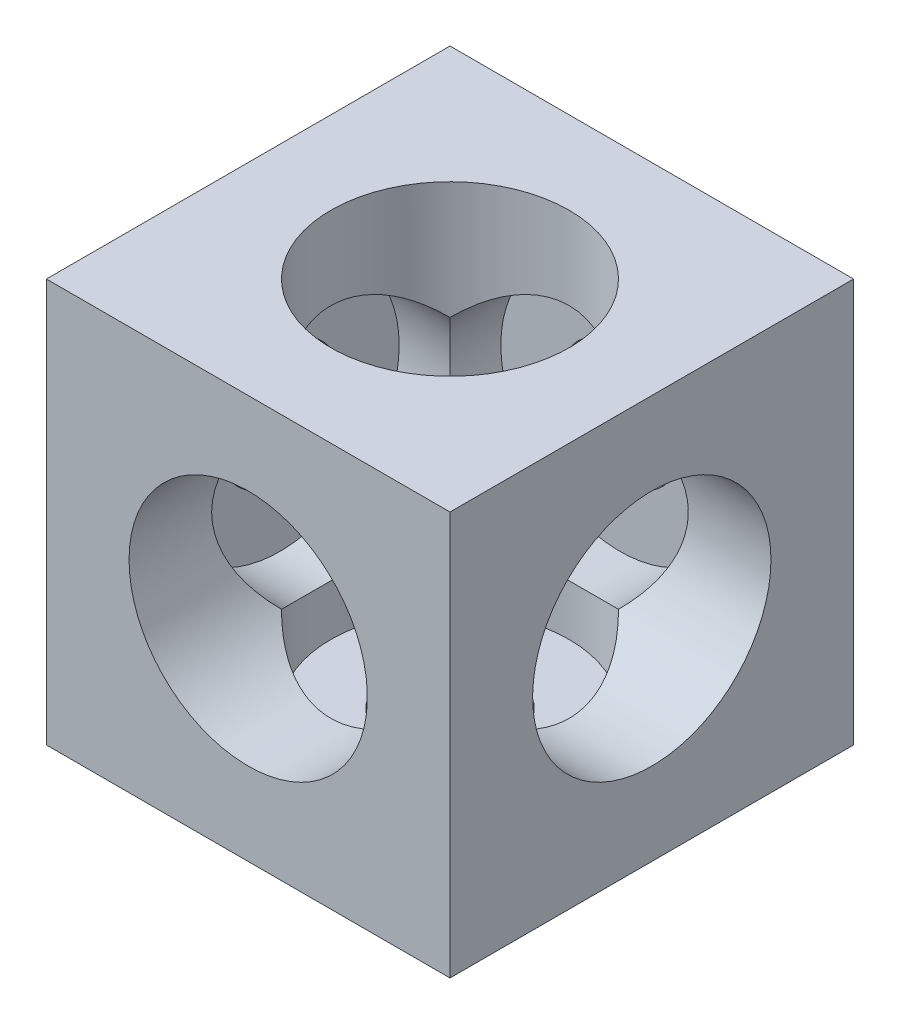
ISO-10303-21;
HEADER;
FILE_DESCRIPTION(('STEP AP214'),'2;1');
FILE_NAME('part.step','',(''),(''),'','','');
FILE_SCHEMA(('AUTOMOTIVE_DESIGN { 1 0 10303 214 1 1 1 1 }'));
ENDSEC;
DATA;
#1=APPLICATION_CONTEXT('core data for automotive mechanical design processes');
#2=APPLICATION_PROTOCOL_DEFINITION('international standard','automotive_design',2000,#1);
#3=PRODUCT_CONTEXT('',#1,'mechanical');
#4=PRODUCT('Part','Part','',(#3));
#5=PRODUCT_RELATED_PRODUCT_CATEGORY('part','',(#4));
#6=PRODUCT_DEFINITION_FORMATION('','',#4);
#7=PRODUCT_DEFINITION_CONTEXT('part definition',#1,'design');
#8=PRODUCT_DEFINITION('design','',#6,#7);
#9=PRODUCT_DEFINITION_SHAPE('','',#8);
#10=(LENGTH_UNIT() NAMED_UNIT(*) SI_UNIT(.MILLI.,.METRE.));
#11=(NAMED_UNIT(*) PLANE_ANGLE_UNIT() SI_UNIT($,.RADIAN.));
#12=(NAMED_UNIT(*) SI_UNIT($,.STERADIAN.) SOLID_ANGLE_UNIT());
#13=UNCERTAINTY_MEASURE_WITH_UNIT(LENGTH_MEASURE(1.E-05),#10,'distance_accuracy_value','');
#14=(GEOMETRIC_REPRESENTATION_CONTEXT(3) GLOBAL_UNCERTAINTY_ASSIGNED_CONTEXT((#13)) GLOBAL_UNIT_ASSIGNED_CONTEXT((#10,
#11,#12)) REPRESENTATION_CONTEXT('',''));
#15=CARTESIAN_POINT('',(0.,0.,0.));
#16=DIRECTION('',(0.,0.,1.));
#17=DIRECTION('',(1.,0.,0.));
#18=AXIS2_PLACEMENT_3D('',#15,#16,#17);
#19=CARTESIAN_POINT('',(12.7,12.7,25.4));
#20=DIRECTION('',(0.,0.,-1.));
#21=DIRECTION('',(-1.,0.,0.));
#22=AXIS2_PLACEMENT_3D('',#19,#20,#21);
#23=CYLINDRICAL_SURFACE('',#22,7.5);
#24=CARTESIAN_POINT('',(12.7,12.7,25.4));
#25=DIRECTION('',(0.,0.,-1.));
#26=DIRECTION('',(-1.,0.,0.));
#27=AXIS2_PLACEMENT_3D('',#24,#25,#26);
#28=CIRCLE('',#27,7.5);
#29=CARTESIAN_POINT('',(5.2,12.7,25.4));
#30=VERTEX_POINT('',#29);
#31=EDGE_CURVE('E159',#30,#30,#28,.T.);
#32=ORIENTED_EDGE('',*,*,#31,.F.);
#33=EDGE_LOOP('',(#32));
#34=FACE_BOUND('',#33,.T.);
#35=CARTESIAN_POINT('',(12.7,12.7,12.7));
#36=DIRECTION('',(-0.707106781186547,0.,-0.707106781186547));
#37=DIRECTION('',(0.707106781186547,0.,-0.707106781186547));
#38=AXIS2_PLACEMENT_3D('',#35,#36,#37);
#39=ELLIPSE('',#38,10.6066017177982,7.5);
#40=CARTESIAN_POINT('',(7.39669914110089,18.0033008588991,18.0033008588991));
#41=VERTEX_POINT('',#40);
#42=CARTESIAN_POINT('',(7.39669914110089,7.3966991411009,18.0033008588991));
#43=VERTEX_POINT('',#42);
#44=EDGE_CURVE('E130',#41,#43,#39,.F.);
#45=ORIENTED_EDGE('',*,*,#44,.F.);
#46=CARTESIAN_POINT('',(12.7,12.7,12.7));
#47=DIRECTION('',(0.,0.707106781186547,-0.707106781186547));
#48=DIRECTION('',(0.,-0.707106781186547,-0.707106781186547));
#49=AXIS2_PLACEMENT_3D('',#46,#47,#48);
#50=ELLIPSE('',#49,10.6066017177982,7.5);
#51=CARTESIAN_POINT('',(18.0033008588991,18.0033008588991,18.0033008588991));
#52=VERTEX_POINT('',#51);
#53=EDGE_CURVE('E107',#41,#52,#50,.T.);
#54=ORIENTED_EDGE('',*,*,#53,.T.);
#55=CARTESIAN_POINT('',(12.7,12.7,12.7));
#56=DIRECTION('',(0.707106781186547,0.,-0.707106781186547));
#57=DIRECTION('',(-0.707106781186547,0.,-0.707106781186547));
#58=AXIS2_PLACEMENT_3D('',#55,#56,#57);
#59=ELLIPSE('',#58,10.6066017177982,7.5);
#60=CARTESIAN_POINT('',(18.0033008588991,7.3966991411009,18.0033008588991));
#61=VERTEX_POINT('',#60);
#62=EDGE_CURVE('E135',#61,#52,#59,.F.);
#63=ORIENTED_EDGE('',*,*,#62,.F.);
#64=CARTESIAN_POINT('',(12.7,12.7,12.7));
#65=DIRECTION('',(0.,-0.707106781186547,-0.707106781186547));
#66=DIRECTION('',(0.,0.707106781186547,-0.707106781186547));
#67=AXIS2_PLACEMENT_3D('',#64,#65,#66);
#68=ELLIPSE('',#67,10.6066017177982,7.5);
#69=EDGE_CURVE('E111',#61,#43,#68,.T.);
#70=ORIENTED_EDGE('',*,*,#69,.T.);
#71=EDGE_LOOP('',(#45,#54,#63,#70));
#72=FACE_BOUND('',#71,.T.);
#73=ADVANCED_FACE('F32',(#34,#72),#23,.F.);
#74=CARTESIAN_POINT('',(12.7,25.4,12.7));
#75=DIRECTION('',(0.,-1.,0.));
#76=DIRECTION('',(0.,0.,-1.));
#77=AXIS2_PLACEMENT_3D('',#74,#75,#76);
#78=CYLINDRICAL_SURFACE('',#77,7.5);
#79=CARTESIAN_POINT('',(12.7,2.,12.7));
#80=DIRECTION('',(0.,-1.,0.));
#81=DIRECTION('',(0.,0.,-1.));
#82=AXIS2_PLACEMENT_3D('',#79,#80,#81);
#83=CIRCLE('',#82,7.5);
#84=CARTESIAN_POINT('',(12.7,2.,5.2));
#85=VERTEX_POINT('',#84);
#86=EDGE_CURVE('E150',#85,#85,#83,.T.);
#87=ORIENTED_EDGE('',*,*,#86,.T.);
#88=EDGE_LOOP('',(#87));
#89=FACE_BOUND('',#88,.T.);
#90=CARTESIAN_POINT('',(12.7,12.7,12.7));
#91=DIRECTION('',(-0.707106781186547,-0.707106781186547,0.));
#92=DIRECTION('',(0.707106781186547,-0.707106781186547,0.));
#93=AXIS2_PLACEMENT_3D('',#90,#91,#92);
#94=ELLIPSE('',#93,10.6066017177982,7.5);
#95=CARTESIAN_POINT('',(18.0033008588991,7.39669914110089,7.39669914110089));
#96=VERTEX_POINT('',#95);
#97=EDGE_CURVE('E133',#96,#61,#94,.T.);
#98=ORIENTED_EDGE('',*,*,#97,.F.);
#99=CARTESIAN_POINT('',(12.7,12.7,12.7));
#100=DIRECTION('',(0.,0.707106781186547,-0.707106781186547));
#101=DIRECTION('',(0.,-0.707106781186547,-0.707106781186547));
#102=AXIS2_PLACEMENT_3D('',#99,#100,#101);
#103=ELLIPSE('',#102,10.6066017177982,7.5);
#104=CARTESIAN_POINT('',(7.39669914110089,7.39669914110089,7.39669914110089));
#105=VERTEX_POINT('',#104);
#106=EDGE_CURVE('E194',#105,#96,#103,.F.);
#107=ORIENTED_EDGE('',*,*,#106,.F.);
#108=CARTESIAN_POINT('',(12.7,12.7,12.7));
#109=DIRECTION('',(0.707106781186547,-0.707106781186547,0.));
#110=DIRECTION('',(-0.707106781186547,-0.707106781186547,0.));
#111=AXIS2_PLACEMENT_3D('',#108,#109,#110);
#112=ELLIPSE('',#111,10.6066017177982,7.5);
#113=EDGE_CURVE('E47',#43,#105,#112,.T.);
#114=ORIENTED_EDGE('',*,*,#113,.F.);
#115=ORIENTED_EDGE('',*,*,#69,.F.);
#116=EDGE_LOOP('',(#98,#107,#114,#115));
#117=FACE_BOUND('',#116,.T.);
#118=ADVANCED_FACE('F200',(#89,#117),#78,.F.);
#119=CARTESIAN_POINT('',(12.7,25.4,12.7));
#120=DIRECTION('',(0.,-1.,0.));
#121=DIRECTION('',(0.,0.,-1.));
#122=AXIS2_PLACEMENT_3D('',#119,#120,#121);
#123=CIRCLE('',#122,7.5);
#124=CARTESIAN_POINT('',(12.7,25.4,5.2));
#125=VERTEX_POINT('',#124);
#126=EDGE_CURVE('E153',#125,#125,#123,.T.);
#127=ORIENTED_EDGE('',*,*,#126,.F.);
#128=EDGE_LOOP('',(#127));
#129=FACE_BOUND('',#128,.T.);
#130=CARTESIAN_POINT('',(12.7,12.7,12.7));
#131=DIRECTION('',(-0.707106781186547,-0.707106781186547,0.));
#132=DIRECTION('',(0.707106781186547,-0.707106781186547,0.));
#133=AXIS2_PLACEMENT_3D('',#130,#131,#132);
#134=ELLIPSE('',#133,10.6066017177982,7.5);
#135=CARTESIAN_POINT('',(7.39669914110089,18.0033008588991,7.39669914110089));
#136=VERTEX_POINT('',#135);
#137=EDGE_CURVE('E95',#136,#41,#134,.F.);
#138=ORIENTED_EDGE('',*,*,#137,.F.);
#139=CARTESIAN_POINT('',(12.7,12.7,12.7));
#140=DIRECTION('',(0.,-0.707106781186547,-0.707106781186547));
#141=DIRECTION('',(0.,0.707106781186547,-0.707106781186547));
#142=AXIS2_PLACEMENT_3D('',#139,#140,#141);
#143=ELLIPSE('',#142,10.6066017177982,7.5);
#144=CARTESIAN_POINT('',(18.0033008588991,18.0033008588991,7.39669914110089));
#145=VERTEX_POINT('',#144);
#146=EDGE_CURVE('E101',#145,#136,#143,.F.);
#147=ORIENTED_EDGE('',*,*,#146,.F.);
#148=CARTESIAN_POINT('',(12.7,12.7,12.7));
#149=DIRECTION('',(0.707106781186547,-0.707106781186547,0.));
#150=DIRECTION('',(-0.707106781186547,-0.707106781186547,0.));
#151=AXIS2_PLACEMENT_3D('',#148,#149,#150);
#152=ELLIPSE('',#151,10.6066017177982,7.5);
#153=EDGE_CURVE('E54',#52,#145,#152,.F.);
#154=ORIENTED_EDGE('',*,*,#153,.F.);
#155=ORIENTED_EDGE('',*,*,#53,.F.);
#156=EDGE_LOOP('',(#138,#147,#154,#155));
#157=FACE_BOUND('',#156,.T.);
#158=ADVANCED_FACE('F105',(#129,#157),#78,.F.);
#159=CARTESIAN_POINT('',(12.7,12.7,2.));
#160=DIRECTION('',(0.,0.,-1.));
#161=DIRECTION('',(-1.,0.,0.));
#162=AXIS2_PLACEMENT_3D('',#159,#160,#161);
#163=CIRCLE('',#162,7.5);
#164=CARTESIAN_POINT('',(5.2,12.7,2.));
#165=VERTEX_POINT('',#164);
#166=EDGE_CURVE('E156',#165,#165,#163,.T.);
#167=ORIENTED_EDGE('',*,*,#166,.T.);
#168=EDGE_LOOP('',(#167));
#169=FACE_BOUND('',#168,.T.);
#170=CARTESIAN_POINT('',(12.7,12.7,12.7));
#171=DIRECTION('',(-0.707106781186547,0.,-0.707106781186547));
#172=DIRECTION('',(0.707106781186547,0.,-0.707106781186547));
#173=AXIS2_PLACEMENT_3D('',#170,#171,#172);
#174=ELLIPSE('',#173,10.6066017177982,7.5);
#175=EDGE_CURVE('E11',#145,#96,#174,.T.);
#176=ORIENTED_EDGE('',*,*,#175,.F.);
#177=ORIENTED_EDGE('',*,*,#146,.T.);
#178=CARTESIAN_POINT('',(12.7,12.7,12.7));
#179=DIRECTION('',(0.707106781186547,0.,-0.707106781186547));
#180=DIRECTION('',(-0.707106781186547,0.,-0.707106781186547));
#181=AXIS2_PLACEMENT_3D('',#178,#179,#180);
#182=ELLIPSE('',#181,10.6066017177982,7.5);
#183=EDGE_CURVE('E40',#105,#136,#182,.T.);
#184=ORIENTED_EDGE('',*,*,#183,.F.);
#185=ORIENTED_EDGE('',*,*,#106,.T.);
#186=EDGE_LOOP('',(#176,#177,#184,#185));
#187=FACE_BOUND('',#186,.T.);
#188=ADVANCED_FACE('F110',(#169,#187),#23,.F.);
#189=CARTESIAN_POINT('',(10.,12.7,12.7));
#190=DIRECTION('',(-1.,0.,0.));
#191=DIRECTION('',(0.,0.,1.));
#192=AXIS2_PLACEMENT_3D('',#189,#190,#191);
#193=CYLINDRICAL_SURFACE('',#192,3.75);
#194=CARTESIAN_POINT('',(0.,12.7,12.7));
#195=DIRECTION('',(-1.,0.,0.));
#196=DIRECTION('',(0.,0.,1.));
#197=AXIS2_PLACEMENT_3D('',#194,#195,#196);
#198=CIRCLE('',#197,3.75);
#199=CARTESIAN_POINT('',(0.,12.7,16.45));
#200=VERTEX_POINT('',#199);
#201=EDGE_CURVE('E137',#200,#200,#198,.T.);
#202=ORIENTED_EDGE('',*,*,#201,.T.);
#203=EDGE_LOOP('',(#202));
#204=FACE_BOUND('',#203,.T.);
#205=CARTESIAN_POINT('',(2.,12.7,12.7));
#206=DIRECTION('',(1.,0.,0.));
#207=DIRECTION('',(0.,0.,-1.));
#208=AXIS2_PLACEMENT_3D('',#205,#206,#207);
#209=CIRCLE('',#208,3.75);
#210=CARTESIAN_POINT('',(2.,12.7,8.95));
#211=VERTEX_POINT('',#210);
#212=EDGE_CURVE('E108',#211,#211,#209,.F.);
#213=ORIENTED_EDGE('',*,*,#212,.F.);
#214=EDGE_LOOP('',(#213));
#215=FACE_BOUND('',#214,.T.);
#216=ADVANCED_FACE('F223',(#204,#215),#193,.F.);
#217=CARTESIAN_POINT('',(0.,0.,25.4));
#218=DIRECTION('',(1.,0.,0.));
#219=DIRECTION('',(0.,0.,-1.));
#220=AXIS2_PLACEMENT_3D('',#217,#218,#219);
#221=PLANE('',#220);
#222=ORIENTED_EDGE('',*,*,#201,.F.);
#223=EDGE_LOOP('',(#222));
#224=FACE_BOUND('',#223,.T.);
#225=DIRECTION('',(0.,-1.,0.));
#226=VECTOR('',#225,1.);
#227=CARTESIAN_POINT('',(0.,0.,0.));
#228=LINE('',#227,#226);
#229=CARTESIAN_POINT('',(0.,25.4,0.));
#230=VERTEX_POINT('',#229);
#231=CARTESIAN_POINT('',(0.,0.,0.));
#232=VERTEX_POINT('',#231);
#233=EDGE_CURVE('E162',#230,#232,#228,.T.);
#234=ORIENTED_EDGE('',*,*,#233,.T.);
#235=DIRECTION('',(0.,0.,-1.));
#236=VECTOR('',#235,1.);
#237=CARTESIAN_POINT('',(0.,0.,25.4));
#238=LINE('',#237,#236);
#239=CARTESIAN_POINT('',(0.,0.,25.4));
#240=VERTEX_POINT('',#239);
#241=EDGE_CURVE('E191',#240,#232,#238,.T.);
#242=ORIENTED_EDGE('',*,*,#241,.F.);
#243=DIRECTION('',(0.,-1.,0.));
#244=VECTOR('',#243,1.);
#245=CARTESIAN_POINT('',(0.,0.,25.4));
#246=LINE('',#245,#244);
#247=CARTESIAN_POINT('',(0.,25.4,25.4));
#248=VERTEX_POINT('',#247);
#249=EDGE_CURVE('E165',#248,#240,#246,.T.);
#250=ORIENTED_EDGE('',*,*,#249,.F.);
#251=DIRECTION('',(0.,0.,-1.));
#252=VECTOR('',#251,1.);
#253=CARTESIAN_POINT('',(0.,25.4,25.4));
#254=LINE('',#253,#252);
#255=EDGE_CURVE('E175',#248,#230,#254,.T.);
#256=ORIENTED_EDGE('',*,*,#255,.T.);
#257=EDGE_LOOP('',(#234,#242,#250,#256));
#258=FACE_BOUND('',#257,.T.);
#259=ADVANCED_FACE('F34',(#224,#258),#221,.F.);
#260=CARTESIAN_POINT('',(0.,0.,25.4));
#261=DIRECTION('',(0.,1.,0.));
#262=DIRECTION('',(0.,0.,1.));
#263=AXIS2_PLACEMENT_3D('',#260,#261,#262);
#264=PLANE('',#263);
#265=CARTESIAN_POINT('',(12.7,0.,12.7));
#266=DIRECTION('',(0.,1.,0.));
#267=DIRECTION('',(0.,0.,1.));
#268=AXIS2_PLACEMENT_3D('',#265,#266,#267);
#269=CIRCLE('',#268,3.75);
#270=CARTESIAN_POINT('',(12.7,0.,16.45));
#271=VERTEX_POINT('',#270);
#272=EDGE_CURVE('E147',#271,#271,#269,.T.);
#273=ORIENTED_EDGE('',*,*,#272,.T.);
#274=EDGE_LOOP('',(#273));
#275=FACE_BOUND('',#274,.T.);
#276=DIRECTION('',(1.,0.,0.));
#277=VECTOR('',#276,1.);
#278=CARTESIAN_POINT('',(0.,0.,0.));
#279=LINE('',#278,#277);
#280=CARTESIAN_POINT('',(25.4,0.,0.));
#281=VERTEX_POINT('',#280);
#282=EDGE_CURVE('E178',#232,#281,#279,.T.);
#283=ORIENTED_EDGE('',*,*,#282,.T.);
#284=DIRECTION('',(0.,0.,-1.));
#285=VECTOR('',#284,1.);
#286=CARTESIAN_POINT('',(25.4,0.,25.4));
#287=LINE('',#286,#285);
#288=CARTESIAN_POINT('',(25.4,0.,25.4));
#289=VERTEX_POINT('',#288);
#290=EDGE_CURVE('E188',#289,#281,#287,.T.);
#291=ORIENTED_EDGE('',*,*,#290,.F.);
#292=DIRECTION('',(1.,0.,0.));
#293=VECTOR('',#292,1.);
#294=CARTESIAN_POINT('',(0.,0.,25.4));
#295=LINE('',#294,#293);
#296=EDGE_CURVE('E168',#240,#289,#295,.T.);
#297=ORIENTED_EDGE('',*,*,#296,.F.);
#298=ORIENTED_EDGE('',*,*,#241,.T.);
#299=EDGE_LOOP('',(#283,#291,#297,#298));
#300=FACE_BOUND('',#299,.T.);
#301=ADVANCED_FACE('F279',(#275,#300),#264,.F.);
#302=CARTESIAN_POINT('',(25.4,0.,25.4));
#303=DIRECTION('',(-1.,0.,0.));
#304=DIRECTION('',(0.,0.,1.));
#305=AXIS2_PLACEMENT_3D('',#302,#303,#304);
#306=PLANE('',#305);
#307=CARTESIAN_POINT('',(25.4,12.7,12.7));
#308=DIRECTION('',(1.,0.,0.));
#309=DIRECTION('',(0.,0.,-1.));
#310=AXIS2_PLACEMENT_3D('',#307,#308,#309);
#311=CIRCLE('',#310,7.5);
#312=CARTESIAN_POINT('',(25.4,12.7,5.2));
#313=VERTEX_POINT('',#312);
#314=EDGE_CURVE('E118',#313,#313,#311,.T.);
#315=ORIENTED_EDGE('',*,*,#314,.F.);
#316=EDGE_LOOP('',(#315));
#317=FACE_BOUND('',#316,.T.);
#318=DIRECTION('',(0.,1.,0.));
#319=VECTOR('',#318,1.);
#320=CARTESIAN_POINT('',(25.4,0.,0.));
#321=LINE('',#320,#319);
#322=CARTESIAN_POINT('',(25.4,25.4,0.));
#323=VERTEX_POINT('',#322);
#324=EDGE_CURVE('E180',#281,#323,#321,.T.);
#325=ORIENTED_EDGE('',*,*,#324,.T.);
#326=DIRECTION('',(0.,0.,-1.));
#327=VECTOR('',#326,1.);
#328=CARTESIAN_POINT('',(25.4,25.4,25.4));
#329=LINE('',#328,#327);
#330=CARTESIAN_POINT('',(25.4,25.4,25.4));
#331=VERTEX_POINT('',#330);
#332=EDGE_CURVE('E185',#331,#323,#329,.T.);
#333=ORIENTED_EDGE('',*,*,#332,.F.);
#334=DIRECTION('',(0.,1.,0.));
#335=VECTOR('',#334,1.);
#336=CARTESIAN_POINT('',(25.4,0.,25.4));
#337=LINE('',#336,#335);
#338=EDGE_CURVE('E171',#289,#331,#337,.T.);
#339=ORIENTED_EDGE('',*,*,#338,.F.);
#340=ORIENTED_EDGE('',*,*,#290,.T.);
#341=EDGE_LOOP('',(#325,#333,#339,#340));
#342=FACE_BOUND('',#341,.T.);
#343=ADVANCED_FACE('F276',(#317,#342),#306,.F.);
#344=CARTESIAN_POINT('',(0.,25.4,25.4));
#345=DIRECTION('',(0.,-1.,0.));
#346=DIRECTION('',(0.,0.,-1.));
#347=AXIS2_PLACEMENT_3D('',#344,#345,#346);
#348=PLANE('',#347);
#349=ORIENTED_EDGE('',*,*,#126,.T.);
#350=EDGE_LOOP('',(#349));
#351=FACE_BOUND('',#350,.T.);
#352=DIRECTION('',(-1.,0.,0.));
#353=VECTOR('',#352,1.);
#354=CARTESIAN_POINT('',(0.,25.4,0.));
#355=LINE('',#354,#353);
#356=EDGE_CURVE('E169',#323,#230,#355,.T.);
#357=ORIENTED_EDGE('',*,*,#356,.T.);
#358=ORIENTED_EDGE('',*,*,#255,.F.);
#359=DIRECTION('',(-1.,0.,0.));
#360=VECTOR('',#359,1.);
#361=CARTESIAN_POINT('',(0.,25.4,25.4));
#362=LINE('',#361,#360);
#363=EDGE_CURVE('E173',#331,#248,#362,.T.);
#364=ORIENTED_EDGE('',*,*,#363,.F.);
#365=ORIENTED_EDGE('',*,*,#332,.T.);
#366=EDGE_LOOP('',(#357,#358,#364,#365));
#367=FACE_BOUND('',#366,.T.);
#368=ADVANCED_FACE('F272',(#351,#367),#348,.F.);
#369=CARTESIAN_POINT('',(0.,0.,25.4));
#370=DIRECTION('',(0.,0.,-1.));
#371=DIRECTION('',(-1.,0.,0.));
#372=AXIS2_PLACEMENT_3D('',#369,#370,#371);
#373=PLANE('',#372);
#374=ORIENTED_EDGE('',*,*,#31,.T.);
#375=EDGE_LOOP('',(#374));
#376=FACE_BOUND('',#375,.T.);
#377=ORIENTED_EDGE('',*,*,#249,.T.);
#378=ORIENTED_EDGE('',*,*,#296,.T.);
#379=ORIENTED_EDGE('',*,*,#338,.T.);
#380=ORIENTED_EDGE('',*,*,#363,.T.);
#381=EDGE_LOOP('',(#377,#378,#379,#380));
#382=FACE_BOUND('',#381,.T.);
#383=ADVANCED_FACE('F261',(#376,#382),#373,.F.);
#384=CARTESIAN_POINT('',(0.,0.,0.));
#385=DIRECTION('',(0.,0.,-1.));
#386=DIRECTION('',(-1.,0.,0.));
#387=AXIS2_PLACEMENT_3D('',#384,#385,#386);
#388=PLANE('',#387);
#389=CARTESIAN_POINT('',(12.7,12.7,0.));
#390=DIRECTION('',(0.,0.,1.));
#391=DIRECTION('',(1.,0.,0.));
#392=AXIS2_PLACEMENT_3D('',#389,#390,#391);
#393=CIRCLE('',#392,3.75);
#394=CARTESIAN_POINT('',(16.45,12.7,0.));
#395=VERTEX_POINT('',#394);
#396=EDGE_CURVE('E141',#395,#395,#393,.T.);
#397=ORIENTED_EDGE('',*,*,#396,.T.);
#398=EDGE_LOOP('',(#397));
#399=FACE_BOUND('',#398,.T.);
#400=ORIENTED_EDGE('',*,*,#233,.F.);
#401=ORIENTED_EDGE('',*,*,#356,.F.);
#402=ORIENTED_EDGE('',*,*,#324,.F.);
#403=ORIENTED_EDGE('',*,*,#282,.F.);
#404=EDGE_LOOP('',(#400,#401,#402,#403));
#405=FACE_BOUND('',#404,.T.);
#406=ADVANCED_FACE('F245',(#399,#405),#388,.T.);
#407=CARTESIAN_POINT('',(12.7,2.,12.7));
#408=DIRECTION('',(0.,-1.,0.));
#409=DIRECTION('',(0.,0.,-1.));
#410=AXIS2_PLACEMENT_3D('',#407,#408,#409);
#411=PLANE('',#410);
#412=CARTESIAN_POINT('',(12.7,2.,12.7));
#413=DIRECTION('',(0.,1.,0.));
#414=DIRECTION('',(0.,0.,1.));
#415=AXIS2_PLACEMENT_3D('',#412,#413,#414);
#416=CIRCLE('',#415,3.75);
#417=CARTESIAN_POINT('',(12.7,2.,16.45));
#418=VERTEX_POINT('',#417);
#419=EDGE_CURVE('E144',#418,#418,#416,.T.);
#420=ORIENTED_EDGE('',*,*,#419,.F.);
#421=EDGE_LOOP('',(#420));
#422=FACE_BOUND('',#421,.T.);
#423=ORIENTED_EDGE('',*,*,#86,.F.);
#424=EDGE_LOOP('',(#423));
#425=FACE_BOUND('',#424,.T.);
#426=ADVANCED_FACE('F236',(#422,#425),#411,.F.);
#427=CARTESIAN_POINT('',(12.7,12.7,2.));
#428=DIRECTION('',(0.,0.,-1.));
#429=DIRECTION('',(-1.,0.,0.));
#430=AXIS2_PLACEMENT_3D('',#427,#428,#429);
#431=PLANE('',#430);
#432=CARTESIAN_POINT('',(12.7,12.7,2.));
#433=DIRECTION('',(0.,0.,1.));
#434=DIRECTION('',(1.,0.,0.));
#435=AXIS2_PLACEMENT_3D('',#432,#433,#434);
#436=CIRCLE('',#435,3.75);
#437=CARTESIAN_POINT('',(16.45,12.7,2.));
#438=VERTEX_POINT('',#437);
#439=EDGE_CURVE('E140',#438,#438,#436,.T.);
#440=ORIENTED_EDGE('',*,*,#439,.F.);
#441=EDGE_LOOP('',(#440));
#442=FACE_BOUND('',#441,.T.);
#443=ORIENTED_EDGE('',*,*,#166,.F.);
#444=EDGE_LOOP('',(#443));
#445=FACE_BOUND('',#444,.T.);
#446=ADVANCED_FACE('F233',(#442,#445),#431,.F.);
#447=CARTESIAN_POINT('',(12.7,0.,12.7));
#448=DIRECTION('',(0.,1.,0.));
#449=DIRECTION('',(0.,0.,1.));
#450=AXIS2_PLACEMENT_3D('',#447,#448,#449);
#451=CYLINDRICAL_SURFACE('',#450,3.75);
#452=ORIENTED_EDGE('',*,*,#272,.F.);
#453=EDGE_LOOP('',(#452));
#454=FACE_BOUND('',#453,.T.);
#455=ORIENTED_EDGE('',*,*,#419,.T.);
#456=EDGE_LOOP('',(#455));
#457=FACE_BOUND('',#456,.T.);
#458=ADVANCED_FACE('F235',(#454,#457),#451,.F.);
#459=CARTESIAN_POINT('',(12.7,12.7,0.));
#460=DIRECTION('',(0.,0.,1.));
#461=DIRECTION('',(1.,0.,0.));
#462=AXIS2_PLACEMENT_3D('',#459,#460,#461);
#463=CYLINDRICAL_SURFACE('',#462,3.75);
#464=ORIENTED_EDGE('',*,*,#396,.F.);
#465=EDGE_LOOP('',(#464));
#466=FACE_BOUND('',#465,.T.);
#467=ORIENTED_EDGE('',*,*,#439,.T.);
#468=EDGE_LOOP('',(#467));
#469=FACE_BOUND('',#468,.T.);
#470=ADVANCED_FACE('F242',(#466,#469),#463,.F.);
#471=CARTESIAN_POINT('',(2.,12.7,12.7));
#472=DIRECTION('',(1.,0.,0.));
#473=DIRECTION('',(0.,0.,-1.));
#474=AXIS2_PLACEMENT_3D('',#471,#472,#473);
#475=PLANE('',#474);
#476=CARTESIAN_POINT('',(2.,12.7,12.7));
#477=DIRECTION('',(1.,0.,0.));
#478=DIRECTION('',(0.,0.,-1.));
#479=AXIS2_PLACEMENT_3D('',#476,#477,#478);
#480=CIRCLE('',#479,7.5);
#481=CARTESIAN_POINT('',(2.,12.7,5.2));
#482=VERTEX_POINT('',#481);
#483=EDGE_CURVE('E122',#482,#482,#480,.T.);
#484=ORIENTED_EDGE('',*,*,#483,.T.);
#485=EDGE_LOOP('',(#484));
#486=FACE_BOUND('',#485,.T.);
#487=ORIENTED_EDGE('',*,*,#212,.T.);
#488=EDGE_LOOP('',(#487));
#489=FACE_BOUND('',#488,.T.);
#490=ADVANCED_FACE('F207',(#486,#489),#475,.T.);
#491=CARTESIAN_POINT('',(25.4,12.7,12.7));
#492=DIRECTION('',(-1.,0.,0.));
#493=DIRECTION('',(0.,0.,1.));
#494=AXIS2_PLACEMENT_3D('',#491,#492,#493);
#495=CYLINDRICAL_SURFACE('',#494,7.5);
#496=ORIENTED_EDGE('',*,*,#483,.F.);
#497=EDGE_LOOP('',(#496));
#498=FACE_BOUND('',#497,.T.);
#499=ORIENTED_EDGE('',*,*,#44,.T.);
#500=ORIENTED_EDGE('',*,*,#113,.T.);
#501=ORIENTED_EDGE('',*,*,#183,.T.);
#502=ORIENTED_EDGE('',*,*,#137,.T.);
#503=EDGE_LOOP('',(#499,#500,#501,#502));
#504=FACE_BOUND('',#503,.T.);
#505=ADVANCED_FACE('F94',(#498,#504),#495,.F.);
#506=ORIENTED_EDGE('',*,*,#314,.T.);
#507=EDGE_LOOP('',(#506));
#508=FACE_BOUND('',#507,.T.);
#509=ORIENTED_EDGE('',*,*,#62,.T.);
#510=ORIENTED_EDGE('',*,*,#153,.T.);
#511=ORIENTED_EDGE('',*,*,#175,.T.);
#512=ORIENTED_EDGE('',*,*,#97,.T.);
#513=EDGE_LOOP('',(#509,#510,#511,#512));
#514=FACE_BOUND('',#513,.T.);
#515=ADVANCED_FACE('F201',(#508,#514),#495,.F.);
#516=CLOSED_SHELL('',(#73,#118,#158,#188,#216,#259,#301,#343,#368,#383,#406,#426,#446,#458,#470,
#490,#505,#515));
#517=MANIFOLD_SOLID_BREP('B2',#516);
#518=ADVANCED_BREP_SHAPE_REPRESENTATION('',(#18,#517),#14);
#519=SHAPE_DEFINITION_REPRESENTATION(#9,#518);
ENDSEC;
END-ISO-10303-21;
